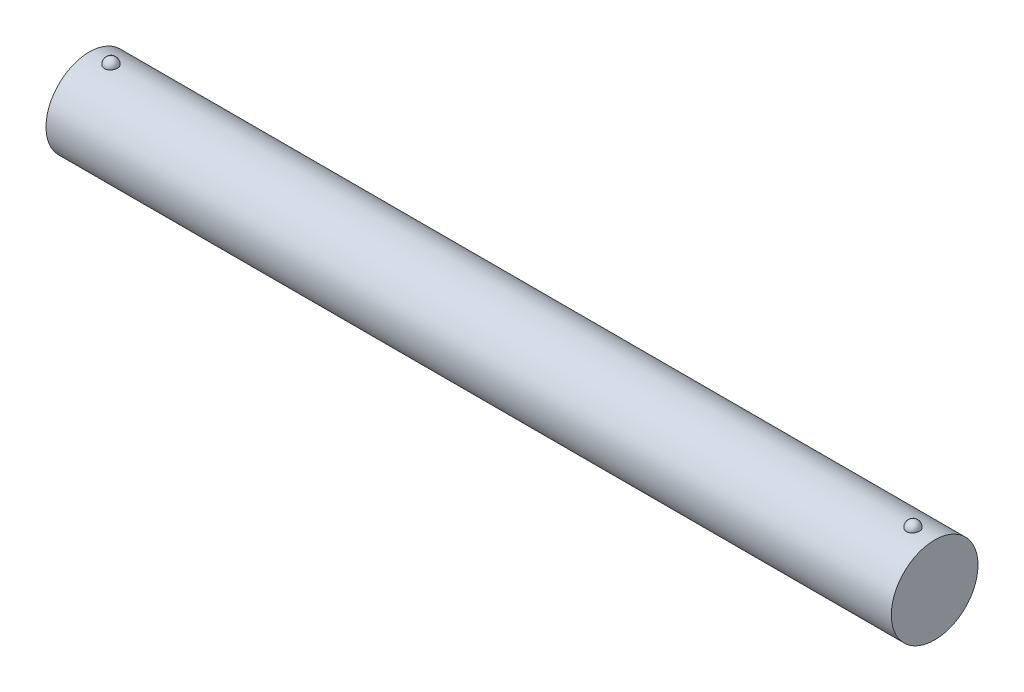
ISO-10303-21;
HEADER;
FILE_DESCRIPTION(('STEP AP214'),'2;1');
FILE_NAME('part.step','',(''),(''),'','','');
FILE_SCHEMA(('AUTOMOTIVE_DESIGN { 1 0 10303 214 1 1 1 1 }'));
ENDSEC;
DATA;
#1=APPLICATION_CONTEXT('core data for automotive mechanical design processes');
#2=APPLICATION_PROTOCOL_DEFINITION('international standard','automotive_design',2000,#1);
#3=PRODUCT_CONTEXT('',#1,'mechanical');
#4=PRODUCT('Part','Part','',(#3));
#5=PRODUCT_RELATED_PRODUCT_CATEGORY('part','',(#4));
#6=PRODUCT_DEFINITION_FORMATION('','',#4);
#7=PRODUCT_DEFINITION_CONTEXT('part definition',#1,'design');
#8=PRODUCT_DEFINITION('design','',#6,#7);
#9=PRODUCT_DEFINITION_SHAPE('','',#8);
#10=(LENGTH_UNIT() NAMED_UNIT(*) SI_UNIT(.MILLI.,.METRE.));
#11=(NAMED_UNIT(*) PLANE_ANGLE_UNIT() SI_UNIT($,.RADIAN.));
#12=(NAMED_UNIT(*) SI_UNIT($,.STERADIAN.) SOLID_ANGLE_UNIT());
#13=UNCERTAINTY_MEASURE_WITH_UNIT(LENGTH_MEASURE(1.E-05),#10,'distance_accuracy_value','');
#14=(GEOMETRIC_REPRESENTATION_CONTEXT(3) GLOBAL_UNCERTAINTY_ASSIGNED_CONTEXT((#13)) GLOBAL_UNIT_ASSIGNED_CONTEXT((#10,
#11,#12)) REPRESENTATION_CONTEXT('',''));
#15=CARTESIAN_POINT('',(0.,0.,0.));
#16=DIRECTION('',(0.,0.,1.));
#17=DIRECTION('',(1.,0.,0.));
#18=AXIS2_PLACEMENT_3D('',#15,#16,#17);
#19=CARTESIAN_POINT('',(0.,75.,0.));
#20=DIRECTION('',(-1.,0.,0.));
#21=DIRECTION('',(0.,0.,1.));
#22=AXIS2_PLACEMENT_3D('',#19,#20,#21);
#23=CYLINDRICAL_SURFACE('',#22,10.);
#24=CARTESIAN_POINT('',(91.,85.,0.));
#25=CARTESIAN_POINT('',(91.,85.,-3.33333333802053E-05));
#26=CARTESIAN_POINT('',(91.0000000011111,84.9999999998333,-6.66666666934953E-05));
#27=CARTESIAN_POINT('',(91.0000000077778,84.9999999988333,-0.000166666666535701));
#28=CARTESIAN_POINT('',(91.0000000166667,84.9999999975,-0.000233333332802099));
#29=CARTESIAN_POINT('',(91.0000000833332,84.9999999875,-0.000566666670623773));
#30=CARTESIAN_POINT('',(91.0000002077764,84.9999999688337,-0.000833333334347354));
#31=CARTESIAN_POINT('',(91.0000011855616,84.999999822165,-0.002166666937081));
#32=CARTESIAN_POINT('',(91.000003105611,84.9999995341509,-0.00323333298335905));
#33=CARTESIAN_POINT('',(91.000018394344,84.9999972408875,-0.00856668779227113));
#34=CARTESIAN_POINT('',(91.0000488284829,84.9999926760597,-0.0128333385992794));
#35=CARTESIAN_POINT('',(91.0002920670461,84.9999561909897,-0.0341679424704289));
#36=CARTESIAN_POINT('',(91.0007780749363,84.9998832879754,-0.0512327930970263));
#37=CARTESIAN_POINT('',(91.0046704948339,84.9993000346376,-0.136653399731389));
#38=CARTESIAN_POINT('',(91.0124640479924,84.9981334751676,-0.204836561107441));
#39=CARTESIAN_POINT('',(91.0499915649787,84.9925886039244,-0.40796961612846));
#40=CARTESIAN_POINT('',(91.0939646510666,84.9861523589336,-0.540458739260444));
#41=CARTESIAN_POINT('',(91.2293988609073,84.9679544521536,-0.813911036958));
#42=CARTESIAN_POINT('',(91.3288307427276,84.9553639516234,-0.950911673415405));
#43=CARTESIAN_POINT('',(91.5677414122064,84.9302462998338,-1.18509123408911));
#44=CARTESIAN_POINT('',(91.7074317438634,84.9177198485712,-1.28205304357999));
#45=CARTESIAN_POINT('',(92.0122618793858,84.8982598397341,-1.42478107160955));
#46=CARTESIAN_POINT('',(92.1774702900432,84.8913416832957,-1.4704064455859));
#47=CARTESIAN_POINT('',(92.396255000668,84.887893299492,-1.4931388669062));
#48=CARTESIAN_POINT('',(92.448077867542,84.8874882493683,-1.49580717246932));
#49=CARTESIAN_POINT('',(92.6678032578183,84.8875379759882,-1.49567229645118));
#50=CARTESIAN_POINT('',(92.8366433143191,84.8919293084666,-1.46736676473233));
#51=CARTESIAN_POINT('',(93.1547480973795,84.9076421164824,-1.35698651117524));
#52=CARTESIAN_POINT('',(93.3040139989757,84.9189631757968,-1.27491501868256));
#53=CARTESIAN_POINT('',(93.5671953258337,84.9435724236564,-1.06595641349553));
#54=CARTESIAN_POINT('',(93.681061283644,84.956863326905,-0.939007113433689));
#55=CARTESIAN_POINT('',(93.8601356602538,84.9795787380592,-0.654190486835028));
#56=CARTESIAN_POINT('',(93.9253880652518,84.9890067376869,-0.496351273620512));
#57=CARTESIAN_POINT('',(93.9875212740809,84.9981119582965,-0.223304470671121));
#58=CARTESIAN_POINT('',(93.9999925538814,84.999998878239,-0.111551727585178));
#59=CARTESIAN_POINT('',(93.9999999988927,84.9999999998354,-6.66666396599974E-05));
#60=CARTESIAN_POINT('',(94.0000000000038,85.000000000002,-3.33333063268143E-05));
#61=CARTESIAN_POINT('',(94.,85.,0.));
#62=B_SPLINE_CURVE_WITH_KNOTS('',3,(#24,#25,#26,#27,#28,#29,#30,#31,#32,#33,#34,#35,#36,#37,#38,
#39,#40,#41,#42,#43,#44,#45,#46,#47,#48,#49,#50,#51,#52,#53,#54,#55,#56,#57,#58,#59,#60,#61),
.UNSPECIFIED.,.F.,.F.,(4,2,2,2,2,2,2,2,2,2,2,2,2,2,2,2,2,2,4),(0.,9.99999999751643E-05,
0.000300000000420048,0.00110000002950031,0.00430000189090006,0.0171001210243788,
0.0683077490196317,0.273599517252443,0.687219458852744,1.18681141135129,1.68907796271363,
2.19271917754967,2.34831261554565,2.85116341451882,3.35398401352706,3.85750412212804,
4.36056808377082,4.69492299635886,4.69502299635883),.UNSPECIFIED.);
#63=CARTESIAN_POINT('',(91.,85.,0.));
#64=VERTEX_POINT('',#63);
#65=CARTESIAN_POINT('',(94.,85.,0.));
#66=VERTEX_POINT('',#65);
#67=EDGE_CURVE('E75',#64,#66,#62,.T.);
#68=ORIENTED_EDGE('',*,*,#67,.T.);
#69=CARTESIAN_POINT('',(94.,85.,0.));
#70=CARTESIAN_POINT('',(94.,85.,3.33333333785252E-05));
#71=CARTESIAN_POINT('',(93.9999999988889,84.9999999998333,6.66666666917613E-05));
#72=CARTESIAN_POINT('',(93.9999999922222,84.9999999988333,0.000166666666533643));
#73=CARTESIAN_POINT('',(93.9999999833333,84.9999999975,0.000233333332799609));
#74=CARTESIAN_POINT('',(93.9999999166669,84.9999999875,0.000566666670624523));
#75=CARTESIAN_POINT('',(93.999999792224,84.9999999688337,0.000833333334367978));
#76=CARTESIAN_POINT('',(93.9999988144371,84.9999998221651,0.0021666669369893));
#77=CARTESIAN_POINT('',(93.9999968943763,84.9999995341516,0.00323333298250004));
#78=CARTESIAN_POINT('',(93.9999816057069,84.999997240885,0.00856668779569798));
#79=CARTESIAN_POINT('',(93.9999511720044,84.999992676035,0.012833338632127));
#80=CARTESIAN_POINT('',(93.9997079310047,84.9999561910888,0.034167942339011));
#81=CARTESIAN_POINT('',(93.9992219063831,84.9998832889246,0.0512327918375916));
#82=CARTESIAN_POINT('',(93.9953295800569,84.9993000308325,0.136653404780463));
#83=CARTESIAN_POINT('',(93.9875366709362,84.9981334386397,0.204836609577017));
#84=CARTESIAN_POINT('',(93.9500069865307,84.9925886775204,0.407969518472404));
#85=CARTESIAN_POINT('',(93.9060269191514,84.9861527872406,0.540458170931443));
#86=CARTESIAN_POINT('',(93.7706113210274,84.9679539348219,0.813911723415701));
#87=CARTESIAN_POINT('',(93.6712121044813,84.9553617746088,0.950914562139141));
#88=CARTESIAN_POINT('',(93.4322155111994,84.9302484885031,1.1850883299004));
#89=CARTESIAN_POINT('',(93.2924057797787,84.9177281037973,1.28204208955697));
#90=CARTESIAN_POINT('',(92.9879010416569,84.8982515619141,1.42479205561285));
#91=CARTESIAN_POINT('',(92.8231389732202,84.8913107273705,1.47044752161627));
#92=CARTESIAN_POINT('',(92.4878894850014,84.8861077335835,1.50507240324695));
#93=CARTESIAN_POINT('',(92.3174114365786,84.8878319986087,1.49413048998491));
#94=CARTESIAN_POINT('',(91.989932201519,84.89916232887,1.41703006089075));
#95=CARTESIAN_POINT('',(91.8329171185188,84.9087601562173,1.35092925502732));
#96=CARTESIAN_POINT('',(91.5494568711828,84.9316576668652,1.17054245740578));
#97=CARTESIAN_POINT('',(91.4230674481604,84.9449640067583,1.05616962813402));
#98=CARTESIAN_POINT('',(91.2152829496858,84.9694707070491,0.791880650241338));
#99=CARTESIAN_POINT('',(91.1339106996008,84.9806699971993,0.641946525675042));
#100=CARTESIAN_POINT('',(91.0270522178644,84.9958334322239,0.327254540098797));
#101=CARTESIAN_POINT('',(91.0000109643815,84.9999983331184,0.163053931917415));
#102=CARTESIAN_POINT('',(91.0000000010912,84.9999999998409,6.6666614416149E-05));
#103=CARTESIAN_POINT('',(90.9999999999801,85.0000000000075,3.33332810802976E-05));
#104=CARTESIAN_POINT('',(91.,85.,0.));
#105=B_SPLINE_CURVE_WITH_KNOTS('',3,(#69,#70,#71,#72,#73,#74,#75,#76,#77,#78,#79,#80,#81,#82,
#83,#84,#85,#86,#87,#88,#89,#90,#91,#92,#93,#94,#95,#96,#97,#98,#99,#100,#101,#102,#103,#104),
.UNSPECIFIED.,.F.,.F.,(4,2,2,2,2,2,2,2,2,2,2,2,2,2,2,2,2,4),(0.,9.99999999751643E-05,
0.000300000000420048,0.00110000002950031,0.00430000189090006,0.0171001210243788,
0.0683077490196317,0.273599517252444,0.687219458852743,1.18681141135129,1.68907796271363,
2.19271917754965,2.69557157695005,3.19789852590524,3.70113299859961,4.20462239642374,
4.69348342696841,4.69358342696838),.UNSPECIFIED.);
#106=EDGE_CURVE('E60',#66,#64,#105,.T.);
#107=ORIENTED_EDGE('',*,*,#106,.T.);
#108=EDGE_LOOP('',(#68,#107));
#109=FACE_BOUND('',#108,.T.);
#110=CARTESIAN_POINT('',(97.5,75.,0.));
#111=DIRECTION('',(1.,0.,0.));
#112=DIRECTION('',(0.,0.,-1.));
#113=AXIS2_PLACEMENT_3D('',#110,#111,#112);
#114=CIRCLE('',#113,10.);
#115=CARTESIAN_POINT('',(97.5,75.,-10.));
#116=VERTEX_POINT('',#115);
#117=EDGE_CURVE('E113',#116,#116,#114,.T.);
#118=ORIENTED_EDGE('',*,*,#117,.F.);
#119=EDGE_LOOP('',(#118));
#120=FACE_BOUND('',#119,.T.);
#121=CARTESIAN_POINT('',(-94.,85.,0.));
#122=CARTESIAN_POINT('',(-94.,85.,-3.3333333380815E-05));
#123=CARTESIAN_POINT('',(-93.9999999988889,84.9999999998333,-6.6666666694105E-05));
#124=CARTESIAN_POINT('',(-93.9999999922222,84.9999999988333,-0.00016666666653631));
#125=CARTESIAN_POINT('',(-93.9999999833333,84.9999999975,-0.000233333332802709));
#126=CARTESIAN_POINT('',(-93.9999999166668,84.9999999875,-0.000566666670624382));
#127=CARTESIAN_POINT('',(-93.9999997922236,84.9999999688337,-0.000833333334347964));
#128=CARTESIAN_POINT('',(-93.9999988144384,84.999999822165,-0.00216666693708161));
#129=CARTESIAN_POINT('',(-93.999996894389,84.9999995341509,-0.00323333298335966));
#130=CARTESIAN_POINT('',(-93.999981605656,84.9999972408875,-0.00856668779227174));
#131=CARTESIAN_POINT('',(-93.9999511715171,84.9999926760597,-0.01283333859928));
#132=CARTESIAN_POINT('',(-93.9997079329539,84.9999561909897,-0.0341679424704295));
#133=CARTESIAN_POINT('',(-93.9992219250637,84.9998832879754,-0.0512327930970269));
#134=CARTESIAN_POINT('',(-93.9953295051661,84.9993000346376,-0.136653399731389));
#135=CARTESIAN_POINT('',(-93.9875359520076,84.9981334751676,-0.204836561107441));
#136=CARTESIAN_POINT('',(-93.9500084350213,84.9925886039244,-0.40796961612846));
#137=CARTESIAN_POINT('',(-93.9060353489334,84.9861523589336,-0.540458739260444));
#138=CARTESIAN_POINT('',(-93.7706011390927,84.9679544521536,-0.813911036958001));
#139=CARTESIAN_POINT('',(-93.6711692572724,84.9553639516234,-0.950911673415406));
#140=CARTESIAN_POINT('',(-93.4322585877936,84.9302462998338,-1.18509123408912));
#141=CARTESIAN_POINT('',(-93.2925682561366,84.9177198485712,-1.28205304357999));
#142=CARTESIAN_POINT('',(-92.9877381206142,84.8982598397341,-1.42478107160955));
#143=CARTESIAN_POINT('',(-92.8225297099568,84.8913416832957,-1.4704064455859));
#144=CARTESIAN_POINT('',(-92.603744999332,84.887893299492,-1.4931388669062));
#145=CARTESIAN_POINT('',(-92.551922132458,84.8874882493683,-1.49580717246932));
#146=CARTESIAN_POINT('',(-92.3321967421817,84.8875379759882,-1.49567229645118));
#147=CARTESIAN_POINT('',(-92.1633566856809,84.8919293084666,-1.46736676473233));
#148=CARTESIAN_POINT('',(-91.8452519026204,84.9076421164824,-1.35698651117524));
#149=CARTESIAN_POINT('',(-91.6959860010243,84.9189631757968,-1.27491501868256));
#150=CARTESIAN_POINT('',(-91.4328046741663,84.9435724236564,-1.06595641349553));
#151=CARTESIAN_POINT('',(-91.318938716356,84.956863326905,-0.93900711343369));
#152=CARTESIAN_POINT('',(-91.1398643397462,84.9795787380592,-0.654190486835029));
#153=CARTESIAN_POINT('',(-91.0746119347482,84.9890067376869,-0.496351273620513));
#154=CARTESIAN_POINT('',(-91.0124787259191,84.9981119582965,-0.223304470671122));
#155=CARTESIAN_POINT('',(-91.0000074461186,84.999998878239,-0.111551727585179));
#156=CARTESIAN_POINT('',(-91.0000000011073,84.9999999998354,-6.66666396606072E-05));
#157=CARTESIAN_POINT('',(-90.9999999999962,85.000000000002,-3.33333063274241E-05));
#158=CARTESIAN_POINT('',(-91.,85.,0.));
#159=B_SPLINE_CURVE_WITH_KNOTS('',3,(#121,#122,#123,#124,#125,#126,#127,#128,#129,#130,#131,
#132,#133,#134,#135,#136,#137,#138,#139,#140,#141,#142,#143,#144,#145,#146,#147,#148,#149,#150,
#151,#152,#153,#154,#155,#156,#157,#158),.UNSPECIFIED.,.F.,.F.,(4,2,2,2,2,2,2,2,2,2,2,2,2,2,2,2,
2,2,4),(0.,9.99999999751643E-05,0.000300000000420048,0.00110000002950031,0.00430000189090006,
0.0171001210243788,0.0683077490196317,0.273599517252443,0.687219458852744,1.18681141135129,
1.68907796271363,2.19271917754965,2.34831261554565,2.85116341451882,3.35398401352706,
3.85750412212804,4.36056808377082,4.69492299635886,4.69502299635883),.UNSPECIFIED.);
#160=CARTESIAN_POINT('',(-94.,85.,0.));
#161=VERTEX_POINT('',#160);
#162=CARTESIAN_POINT('',(-91.,85.,0.));
#163=VERTEX_POINT('',#162);
#164=EDGE_CURVE('E48',#161,#163,#159,.T.);
#165=ORIENTED_EDGE('',*,*,#164,.T.);
#166=CARTESIAN_POINT('',(-91.,85.,0.));
#167=CARTESIAN_POINT('',(-91.,85.,3.33333333779155E-05));
#168=CARTESIAN_POINT('',(-91.0000000011111,84.9999999998333,6.66666666911515E-05));
#169=CARTESIAN_POINT('',(-91.0000000077778,84.9999999988333,0.000166666666533033));
#170=CARTESIAN_POINT('',(-91.0000000166667,84.9999999975,0.000233333332799));
#171=CARTESIAN_POINT('',(-91.0000000833331,84.9999999875,0.000566666670623913));
#172=CARTESIAN_POINT('',(-91.000000207776,84.9999999688337,0.000833333334367368));
#173=CARTESIAN_POINT('',(-91.0000011855629,84.9999998221651,0.00216666693698869));
#174=CARTESIAN_POINT('',(-91.0000031056237,84.9999995341516,0.00323333298249943));
#175=CARTESIAN_POINT('',(-91.0000183942931,84.999997240885,0.00856668779569738));
#176=CARTESIAN_POINT('',(-91.0000488279956,84.999992676035,0.0128333386321264));
#177=CARTESIAN_POINT('',(-91.0002920689953,84.9999561910888,0.0341679423390104));
#178=CARTESIAN_POINT('',(-91.0007780936169,84.9998832889246,0.051232791837591));
#179=CARTESIAN_POINT('',(-91.0046704199431,84.9993000308325,0.136653404780462));
#180=CARTESIAN_POINT('',(-91.0124633290638,84.9981334386397,0.204836609577016));
#181=CARTESIAN_POINT('',(-91.0499930134693,84.9925886775204,0.407969518472403));
#182=CARTESIAN_POINT('',(-91.0939730808486,84.9861527872406,0.540458170931443));
#183=CARTESIAN_POINT('',(-91.2293886789726,84.9679539348219,0.813911723415701));
#184=CARTESIAN_POINT('',(-91.3287878955187,84.9553617746088,0.95091456213914));
#185=CARTESIAN_POINT('',(-91.5677844888006,84.9302484885031,1.1850883299004));
#186=CARTESIAN_POINT('',(-91.7075942202213,84.9177281037973,1.28204208955697));
#187=CARTESIAN_POINT('',(-92.0120989583431,84.8982515619141,1.42479205561285));
#188=CARTESIAN_POINT('',(-92.1768610267798,84.8913107273705,1.47044752161627));
#189=CARTESIAN_POINT('',(-92.5121105149986,84.8861077335835,1.50507240324696));
#190=CARTESIAN_POINT('',(-92.6825885634214,84.8878319986087,1.49413048998491));
#191=CARTESIAN_POINT('',(-93.010067798481,84.89916232887,1.41703006089075));
#192=CARTESIAN_POINT('',(-93.1670828814812,84.9087601562174,1.3509292550273));
#193=CARTESIAN_POINT('',(-93.4505431288172,84.9316576668652,1.17054245740577));
#194=CARTESIAN_POINT('',(-93.5769325518396,84.9449640067583,1.05616962813402));
#195=CARTESIAN_POINT('',(-93.7847170503142,84.9694707070491,0.791880650241354));
#196=CARTESIAN_POINT('',(-93.8660893003992,84.9806699971993,0.641946525675057));
#197=CARTESIAN_POINT('',(-93.9729477821356,84.9958334322239,0.327254540098807));
#198=CARTESIAN_POINT('',(-93.9999890356185,84.9999983331184,0.163053931917419));
#199=CARTESIAN_POINT('',(-93.9999999989088,84.9999999998409,6.66666144155393E-05));
#200=CARTESIAN_POINT('',(-94.0000000000199,85.0000000000075,3.33332810796879E-05));
#201=CARTESIAN_POINT('',(-94.,85.,0.));
#202=B_SPLINE_CURVE_WITH_KNOTS('',3,(#166,#167,#168,#169,#170,#171,#172,#173,#174,#175,#176,
#177,#178,#179,#180,#181,#182,#183,#184,#185,#186,#187,#188,#189,#190,#191,#192,#193,#194,#195,
#196,#197,#198,#199,#200,#201),.UNSPECIFIED.,.F.,.F.,(4,2,2,2,2,2,2,2,2,2,2,2,2,2,2,2,2,4),(0.,
9.99999999751643E-05,0.000300000000420048,0.00110000002950031,0.00430000189090006,
0.0171001210243788,0.0683077490196317,0.273599517252443,0.687219458852744,1.18681141135129,
1.68907796271364,2.19271917754963,2.69557157695006,3.19789852590524,3.70113299859959,
4.20462239642372,4.6934834269684,4.69358342696837),.UNSPECIFIED.);
#203=EDGE_CURVE('E12',#163,#161,#202,.T.);
#204=ORIENTED_EDGE('',*,*,#203,.T.);
#205=EDGE_LOOP('',(#165,#204));
#206=FACE_BOUND('',#205,.T.);
#207=CARTESIAN_POINT('',(-97.5,75.,0.));
#208=DIRECTION('',(-1.,0.,0.));
#209=DIRECTION('',(0.,0.,1.));
#210=AXIS2_PLACEMENT_3D('',#207,#208,#209);
#211=CIRCLE('',#210,10.);
#212=CARTESIAN_POINT('',(-97.5,75.,10.));
#213=VERTEX_POINT('',#212);
#214=EDGE_CURVE('E117',#213,#213,#211,.T.);
#215=ORIENTED_EDGE('',*,*,#214,.F.);
#216=EDGE_LOOP('',(#215));
#217=FACE_BOUND('',#216,.T.);
#218=ADVANCED_FACE('F42',(#109,#120,#206,#217),#23,.T.);
#219=CARTESIAN_POINT('',(92.5,85.,0.));
#220=DIRECTION('',(1.,0.,0.));
#221=DIRECTION('',(0.,1.,0.));
#222=AXIS2_PLACEMENT_3D('',#219,#220,#221);
#223=SPHERICAL_SURFACE('',#222,1.5);
#224=ORIENTED_EDGE('',*,*,#106,.F.);
#225=ORIENTED_EDGE('',*,*,#67,.F.);
#226=EDGE_LOOP('',(#224,#225));
#227=FACE_BOUND('',#226,.T.);
#228=ADVANCED_FACE('F44',(#227),#223,.T.);
#229=CARTESIAN_POINT('',(97.5,75.,0.));
#230=DIRECTION('',(1.,0.,0.));
#231=DIRECTION('',(0.,0.,-1.));
#232=AXIS2_PLACEMENT_3D('',#229,#230,#231);
#233=PLANE('',#232);
#234=ORIENTED_EDGE('',*,*,#117,.T.);
#235=EDGE_LOOP('',(#234));
#236=FACE_BOUND('',#235,.T.);
#237=ADVANCED_FACE('F100',(#236),#233,.T.);
#238=CARTESIAN_POINT('',(-92.5,85.,0.));
#239=DIRECTION('',(1.,0.,0.));
#240=DIRECTION('',(0.,1.,0.));
#241=AXIS2_PLACEMENT_3D('',#238,#239,#240);
#242=SPHERICAL_SURFACE('',#241,1.5);
#243=ORIENTED_EDGE('',*,*,#203,.F.);
#244=ORIENTED_EDGE('',*,*,#164,.F.);
#245=EDGE_LOOP('',(#243,#244));
#246=FACE_BOUND('',#245,.T.);
#247=ADVANCED_FACE('F102',(#246),#242,.T.);
#248=CARTESIAN_POINT('',(-97.5,75.,0.));
#249=DIRECTION('',(-1.,0.,0.));
#250=DIRECTION('',(0.,0.,1.));
#251=AXIS2_PLACEMENT_3D('',#248,#249,#250);
#252=PLANE('',#251);
#253=ORIENTED_EDGE('',*,*,#214,.T.);
#254=EDGE_LOOP('',(#253));
#255=FACE_BOUND('',#254,.T.);
#256=ADVANCED_FACE('F109',(#255),#252,.T.);
#257=CLOSED_SHELL('',(#218,#228,#237,#247,#256));
#258=MANIFOLD_SOLID_BREP('B2',#257);
#259=ADVANCED_BREP_SHAPE_REPRESENTATION('',(#18,#258),#14);
#260=SHAPE_DEFINITION_REPRESENTATION(#9,#259);
ENDSEC;
END-ISO-10303-21;
